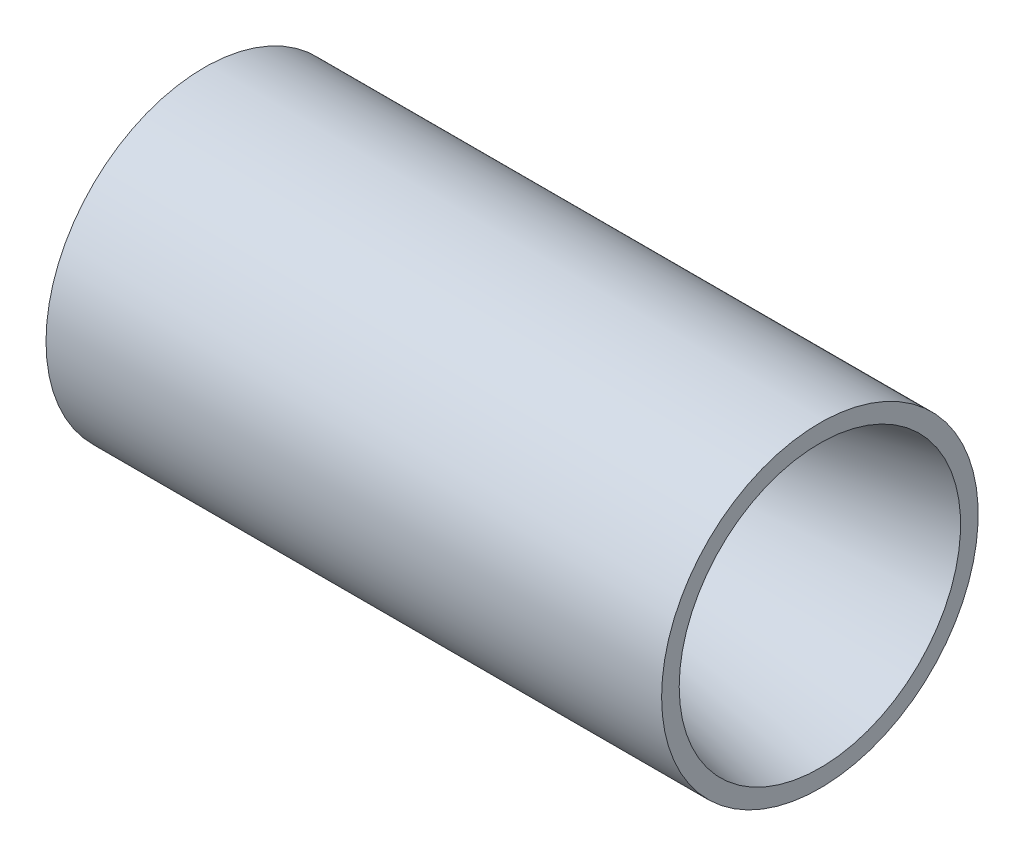
ISO-10303-21;
HEADER;
FILE_DESCRIPTION(('STEP AP214'),'2;1');
FILE_NAME('part.step','',(''),(''),'','','');
FILE_SCHEMA(('AUTOMOTIVE_DESIGN { 1 0 10303 214 1 1 1 1 }'));
ENDSEC;
DATA;
#1=APPLICATION_CONTEXT('core data for automotive mechanical design processes');
#2=APPLICATION_PROTOCOL_DEFINITION('international standard','automotive_design',2000,#1);
#3=PRODUCT_CONTEXT('',#1,'mechanical');
#4=PRODUCT('Part','Part','',(#3));
#5=PRODUCT_RELATED_PRODUCT_CATEGORY('part','',(#4));
#6=PRODUCT_DEFINITION_FORMATION('','',#4);
#7=PRODUCT_DEFINITION_CONTEXT('part definition',#1,'design');
#8=PRODUCT_DEFINITION('design','',#6,#7);
#9=PRODUCT_DEFINITION_SHAPE('','',#8);
#10=(LENGTH_UNIT() NAMED_UNIT(*) SI_UNIT(.MILLI.,.METRE.));
#11=(NAMED_UNIT(*) PLANE_ANGLE_UNIT() SI_UNIT($,.RADIAN.));
#12=(NAMED_UNIT(*) SI_UNIT($,.STERADIAN.) SOLID_ANGLE_UNIT());
#13=UNCERTAINTY_MEASURE_WITH_UNIT(LENGTH_MEASURE(1.E-05),#10,'distance_accuracy_value','');
#14=(GEOMETRIC_REPRESENTATION_CONTEXT(3) GLOBAL_UNCERTAINTY_ASSIGNED_CONTEXT((#13)) GLOBAL_UNIT_ASSIGNED_CONTEXT((#10,
#11,#12)) REPRESENTATION_CONTEXT('',''));
#15=CARTESIAN_POINT('',(0.,0.,0.));
#16=DIRECTION('',(0.,0.,1.));
#17=DIRECTION('',(1.,0.,0.));
#18=AXIS2_PLACEMENT_3D('',#15,#16,#17);
#19=CARTESIAN_POINT('',(0.,0.,0.));
#20=DIRECTION('',(-1.,0.,0.));
#21=DIRECTION('',(0.,0.,1.));
#22=AXIS2_PLACEMENT_3D('',#19,#20,#21);
#23=CONICAL_SURFACE('',#22,8.,0.575958653158123);
#24=CARTESIAN_POINT('',(6.20877157875534,0.,0.));
#25=DIRECTION('',(-1.,0.,0.));
#26=DIRECTION('',(0.,0.,1.));
#27=AXIS2_PLACEMENT_3D('',#24,#25,#26);
#28=CIRCLE('',#27,3.96797659232744);
#29=CARTESIAN_POINT('',(6.20877157875534,0.,3.96797659232744));
#30=VERTEX_POINT('',#29);
#31=EDGE_CURVE('E53',#30,#30,#28,.T.);
#32=ORIENTED_EDGE('',*,*,#31,.F.);
#33=EDGE_LOOP('',(#32));
#34=FACE_BOUND('',#33,.T.);
#35=CARTESIAN_POINT('',(0.,0.,0.));
#36=DIRECTION('',(-1.,0.,0.));
#37=DIRECTION('',(0.,0.,1.));
#38=AXIS2_PLACEMENT_3D('',#35,#36,#37);
#39=CIRCLE('',#38,8.);
#40=CARTESIAN_POINT('',(0.,0.,8.));
#41=VERTEX_POINT('',#40);
#42=EDGE_CURVE('E10',#41,#41,#39,.T.);
#43=ORIENTED_EDGE('',*,*,#42,.T.);
#44=EDGE_LOOP('',(#43));
#45=FACE_BOUND('',#44,.T.);
#46=ADVANCED_FACE('F31',(#34,#45),#23,.F.);
#47=CARTESIAN_POINT('',(0.,8.,0.));
#48=DIRECTION('',(1.,0.,0.));
#49=DIRECTION('',(0.,0.,-1.));
#50=AXIS2_PLACEMENT_3D('',#47,#48,#49);
#51=PLANE('',#50);
#52=ORIENTED_EDGE('',*,*,#42,.F.);
#53=EDGE_LOOP('',(#52));
#54=FACE_BOUND('',#53,.T.);
#55=CARTESIAN_POINT('',(0.,0.,0.));
#56=DIRECTION('',(-1.,0.,0.));
#57=DIRECTION('',(0.,0.,1.));
#58=AXIS2_PLACEMENT_3D('',#55,#56,#57);
#59=CIRCLE('',#58,9.);
#60=CARTESIAN_POINT('',(0.,0.,9.));
#61=VERTEX_POINT('',#60);
#62=EDGE_CURVE('E37',#61,#61,#59,.T.);
#63=ORIENTED_EDGE('',*,*,#62,.T.);
#64=EDGE_LOOP('',(#63));
#65=FACE_BOUND('',#64,.T.);
#66=ADVANCED_FACE('F60',(#54,#65),#51,.F.);
#67=CARTESIAN_POINT('',(0.,0.,0.));
#68=DIRECTION('',(-1.,0.,0.));
#69=DIRECTION('',(0.,0.,1.));
#70=AXIS2_PLACEMENT_3D('',#67,#68,#69);
#71=CYLINDRICAL_SURFACE('',#70,9.);
#72=ORIENTED_EDGE('',*,*,#62,.F.);
#73=EDGE_LOOP('',(#72));
#74=FACE_BOUND('',#73,.T.);
#75=CARTESIAN_POINT('',(35.,0.,0.));
#76=DIRECTION('',(-1.,0.,0.));
#77=DIRECTION('',(0.,0.,1.));
#78=AXIS2_PLACEMENT_3D('',#75,#76,#77);
#79=CIRCLE('',#78,9.);
#80=CARTESIAN_POINT('',(35.,0.,9.));
#81=VERTEX_POINT('',#80);
#82=EDGE_CURVE('E41',#81,#81,#79,.T.);
#83=ORIENTED_EDGE('',*,*,#82,.T.);
#84=EDGE_LOOP('',(#83));
#85=FACE_BOUND('',#84,.T.);
#86=ADVANCED_FACE('F64',(#74,#85),#71,.T.);
#87=CARTESIAN_POINT('',(35.,9.,0.));
#88=DIRECTION('',(-1.,0.,0.));
#89=DIRECTION('',(0.,0.,1.));
#90=AXIS2_PLACEMENT_3D('',#87,#88,#89);
#91=PLANE('',#90);
#92=ORIENTED_EDGE('',*,*,#82,.F.);
#93=EDGE_LOOP('',(#92));
#94=FACE_BOUND('',#93,.T.);
#95=CARTESIAN_POINT('',(35.,0.,0.));
#96=DIRECTION('',(-1.,0.,0.));
#97=DIRECTION('',(0.,0.,1.));
#98=AXIS2_PLACEMENT_3D('',#95,#96,#97);
#99=CIRCLE('',#98,8.);
#100=CARTESIAN_POINT('',(35.,0.,8.));
#101=VERTEX_POINT('',#100);
#102=EDGE_CURVE('E45',#101,#101,#99,.T.);
#103=ORIENTED_EDGE('',*,*,#102,.T.);
#104=EDGE_LOOP('',(#103));
#105=FACE_BOUND('',#104,.T.);
#106=ADVANCED_FACE('F69',(#94,#105),#91,.F.);
#107=CARTESIAN_POINT('',(10.6565889020551,0.,0.));
#108=DIRECTION('',(1.,0.,0.));
#109=DIRECTION('',(0.,0.,-1.));
#110=AXIS2_PLACEMENT_3D('',#107,#108,#109);
#111=CONICAL_SURFACE('',#110,3.11717416095461,0.197954155080654);
#112=ORIENTED_EDGE('',*,*,#102,.F.);
#113=EDGE_LOOP('',(#112));
#114=FACE_BOUND('',#113,.T.);
#115=CARTESIAN_POINT('',(10.6565889020551,0.,0.));
#116=DIRECTION('',(-1.,0.,0.));
#117=DIRECTION('',(0.,0.,1.));
#118=AXIS2_PLACEMENT_3D('',#115,#116,#117);
#119=CIRCLE('',#118,3.11717416095461);
#120=CARTESIAN_POINT('',(10.6565889020551,0.,3.11717416095461));
#121=VERTEX_POINT('',#120);
#122=EDGE_CURVE('E50',#121,#121,#119,.T.);
#123=ORIENTED_EDGE('',*,*,#122,.T.);
#124=EDGE_LOOP('',(#123));
#125=FACE_BOUND('',#124,.T.);
#126=ADVANCED_FACE('F75',(#114,#125),#111,.F.);
#127=CARTESIAN_POINT('',(9.47660578884547,0.,0.));
#128=DIRECTION('',(-1.,0.,0.));
#129=DIRECTION('',(0.,0.,1.));
#130=AXIS2_PLACEMENT_3D('',#127,#128,#129);
#131=TOROIDAL_SURFACE('',#130,9.,6.);
#132=ORIENTED_EDGE('',*,*,#122,.F.);
#133=EDGE_LOOP('',(#132));
#134=FACE_BOUND('',#133,.T.);
#135=ORIENTED_EDGE('',*,*,#31,.T.);
#136=EDGE_LOOP('',(#135));
#137=FACE_BOUND('',#136,.T.);
#138=ADVANCED_FACE('F57',(#134,#137),#131,.T.);
#139=CLOSED_SHELL('',(#46,#66,#86,#106,#126,#138));
#140=MANIFOLD_SOLID_BREP('B2',#139);
#141=ADVANCED_BREP_SHAPE_REPRESENTATION('',(#18,#140),#14);
#142=SHAPE_DEFINITION_REPRESENTATION(#9,#141);
ENDSEC;
END-ISO-10303-21;
